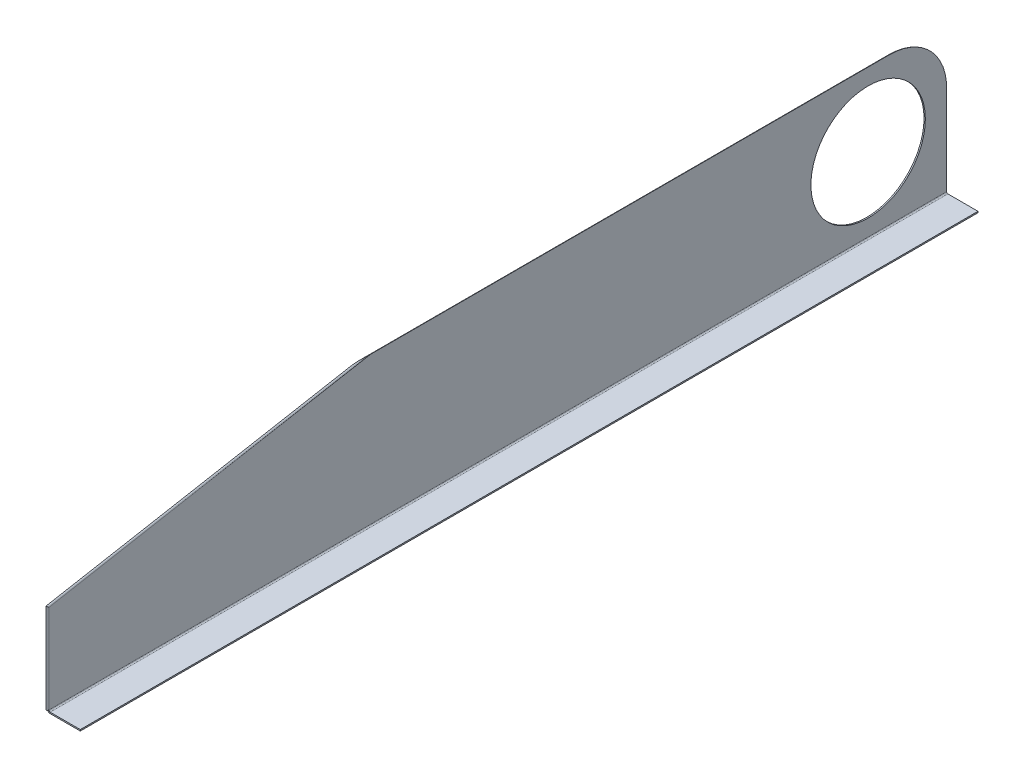
ISO-10303-21;
HEADER;
FILE_DESCRIPTION(('STEP AP214'),'2;1');
FILE_NAME('part.step','',(''),(''),'','','');
FILE_SCHEMA(('AUTOMOTIVE_DESIGN { 1 0 10303 214 1 1 1 1 }'));
ENDSEC;
DATA;
#1=APPLICATION_CONTEXT('core data for automotive mechanical design processes');
#2=APPLICATION_PROTOCOL_DEFINITION('international standard','automotive_design',2000,#1);
#3=PRODUCT_CONTEXT('',#1,'mechanical');
#4=PRODUCT('Part','Part','',(#3));
#5=PRODUCT_RELATED_PRODUCT_CATEGORY('part','',(#4));
#6=PRODUCT_DEFINITION_FORMATION('','',#4);
#7=PRODUCT_DEFINITION_CONTEXT('part definition',#1,'design');
#8=PRODUCT_DEFINITION('design','',#6,#7);
#9=PRODUCT_DEFINITION_SHAPE('','',#8);
#10=(LENGTH_UNIT() NAMED_UNIT(*) SI_UNIT(.MILLI.,.METRE.));
#11=(NAMED_UNIT(*) PLANE_ANGLE_UNIT() SI_UNIT($,.RADIAN.));
#12=(NAMED_UNIT(*) SI_UNIT($,.STERADIAN.) SOLID_ANGLE_UNIT());
#13=UNCERTAINTY_MEASURE_WITH_UNIT(LENGTH_MEASURE(1.E-05),#10,'distance_accuracy_value','');
#14=(GEOMETRIC_REPRESENTATION_CONTEXT(3) GLOBAL_UNCERTAINTY_ASSIGNED_CONTEXT((#13)) GLOBAL_UNIT_ASSIGNED_CONTEXT((#10,
#11,#12)) REPRESENTATION_CONTEXT('',''));
#15=CARTESIAN_POINT('',(0.,0.,0.));
#16=DIRECTION('',(0.,0.,1.));
#17=DIRECTION('',(1.,0.,0.));
#18=AXIS2_PLACEMENT_3D('',#15,#16,#17);
#19=CARTESIAN_POINT('',(-0.8,0.,0.));
#20=DIRECTION('',(1.,0.,0.));
#21=DIRECTION('',(0.,0.,-1.));
#22=AXIS2_PLACEMENT_3D('',#19,#20,#21);
#23=PLANE('',#22);
#24=CARTESIAN_POINT('',(-0.8,0.,-227.));
#25=DIRECTION('',(1.,0.,0.));
#26=DIRECTION('',(0.,0.,-1.));
#27=AXIS2_PLACEMENT_3D('',#24,#25,#26);
#28=CIRCLE('',#27,35.);
#29=CARTESIAN_POINT('',(-0.8,0.,-262.));
#30=VERTEX_POINT('',#29);
#31=EDGE_CURVE('E208',#30,#30,#28,.T.);
#32=ORIENTED_EDGE('',*,*,#31,.T.);
#33=EDGE_LOOP('',(#32));
#34=FACE_BOUND('',#33,.T.);
#35=CARTESIAN_POINT('',(-0.8,10.,-240.));
#36=DIRECTION('',(1.,0.,0.));
#37=DIRECTION('',(0.,0.,-1.));
#38=AXIS2_PLACEMENT_3D('',#35,#36,#37);
#39=CIRCLE('',#38,34.0202041028867);
#40=CARTESIAN_POINT('',(-0.8,44.0202041028868,-240.));
#41=VERTEX_POINT('',#40);
#42=CARTESIAN_POINT('',(-0.8,10.,-274.020204102887));
#43=VERTEX_POINT('',#42);
#44=EDGE_CURVE('E231',#41,#43,#39,.F.);
#45=ORIENTED_EDGE('',*,*,#44,.T.);
#46=DIRECTION('',(0.,-1.,0.));
#47=VECTOR('',#46,1.);
#48=CARTESIAN_POINT('',(-0.8,0.,-274.020204102887));
#49=LINE('',#48,#47);
#50=CARTESIAN_POINT('',(-0.8,-44.9999999999999,-274.020204102887));
#51=VERTEX_POINT('',#50);
#52=EDGE_CURVE('E233',#43,#51,#49,.T.);
#53=ORIENTED_EDGE('',*,*,#52,.T.);
#54=DIRECTION('',(0.,0.,-1.));
#55=VECTOR('',#54,1.);
#56=CARTESIAN_POINT('',(-0.8,-44.9999999999999,-275.));
#57=LINE('',#56,#55);
#58=CARTESIAN_POINT('',(-0.8,-45.,274.020204102887));
#59=VERTEX_POINT('',#58);
#60=EDGE_CURVE('E72',#59,#51,#57,.T.);
#61=ORIENTED_EDGE('',*,*,#60,.F.);
#62=CARTESIAN_POINT('',(-0.8,-45.,275.));
#63=VERTEX_POINT('',#62);
#64=EDGE_CURVE('E218',#63,#59,#57,.T.);
#65=ORIENTED_EDGE('',*,*,#64,.F.);
#66=DIRECTION('',(0.,-1.,0.));
#67=VECTOR('',#66,1.);
#68=CARTESIAN_POINT('',(-0.8,-45.,275.));
#69=LINE('',#68,#67);
#70=CARTESIAN_POINT('',(-0.8,10.1013836535921,275.));
#71=VERTEX_POINT('',#70);
#72=EDGE_CURVE('E214',#71,#63,#69,.T.);
#73=ORIENTED_EDGE('',*,*,#72,.F.);
#74=DIRECTION('',(0.,-0.178802215116343,0.983885037933543));
#75=VECTOR('',#74,1.);
#76=CARTESIAN_POINT('',(-0.8,10.1013836535921,275.));
#77=LINE('',#76,#75);
#78=CARTESIAN_POINT('',(-0.8,44.0202041028867,88.3567868681014));
#79=VERTEX_POINT('',#78);
#80=EDGE_CURVE('E212',#79,#71,#77,.T.);
#81=ORIENTED_EDGE('',*,*,#80,.F.);
#82=DIRECTION('',(0.,0.,-1.));
#83=VECTOR('',#82,1.);
#84=CARTESIAN_POINT('',(-0.8,44.0202041028867,0.));
#85=LINE('',#84,#83);
#86=EDGE_CURVE('E229',#79,#41,#85,.T.);
#87=ORIENTED_EDGE('',*,*,#86,.T.);
#88=EDGE_LOOP('',(#45,#53,#61,#65,#73,#81,#87));
#89=FACE_BOUND('',#88,.T.);
#90=ADVANCED_FACE('F57',(#34,#89),#23,.F.);
#91=CARTESIAN_POINT('',(0.,0.,0.));
#92=DIRECTION('',(1.,0.,0.));
#93=DIRECTION('',(0.,0.,-1.));
#94=AXIS2_PLACEMENT_3D('',#91,#92,#93);
#95=PLANE('',#94);
#96=CARTESIAN_POINT('',(0.,0.,-227.));
#97=DIRECTION('',(1.,0.,0.));
#98=DIRECTION('',(0.,0.,-1.));
#99=AXIS2_PLACEMENT_3D('',#96,#97,#98);
#100=CIRCLE('',#99,35.);
#101=CARTESIAN_POINT('',(0.,0.,-262.));
#102=VERTEX_POINT('',#101);
#103=EDGE_CURVE('E204',#102,#102,#100,.T.);
#104=ORIENTED_EDGE('',*,*,#103,.F.);
#105=EDGE_LOOP('',(#104));
#106=FACE_BOUND('',#105,.T.);
#107=DIRECTION('',(0.,-0.178802215116343,0.983885037933543));
#108=VECTOR('',#107,1.);
#109=CARTESIAN_POINT('',(0.,9.13737713019371,274.824810323234));
#110=LINE('',#109,#108);
#111=CARTESIAN_POINT('',(0.,45.,77.485543358915));
#112=VERTEX_POINT('',#111);
#113=CARTESIAN_POINT('',(0.,9.2835988623553,274.020204102887));
#114=VERTEX_POINT('',#113);
#115=EDGE_CURVE('E220',#112,#114,#110,.T.);
#116=ORIENTED_EDGE('',*,*,#115,.T.);
#117=DIRECTION('',(0.,-1.,0.));
#118=VECTOR('',#117,1.);
#119=CARTESIAN_POINT('',(0.,-45.,274.020204102887));
#120=LINE('',#119,#118);
#121=CARTESIAN_POINT('',(0.,-45.,274.020204102887));
#122=VERTEX_POINT('',#121);
#123=EDGE_CURVE('E244',#114,#122,#120,.T.);
#124=ORIENTED_EDGE('',*,*,#123,.T.);
#125=DIRECTION('',(0.,0.,-1.));
#126=VECTOR('',#125,1.);
#127=CARTESIAN_POINT('',(0.,-44.9999999999999,-275.));
#128=LINE('',#127,#126);
#129=CARTESIAN_POINT('',(0.,-44.9999999999999,-275.));
#130=VERTEX_POINT('',#129);
#131=EDGE_CURVE('E215',#122,#130,#128,.T.);
#132=ORIENTED_EDGE('',*,*,#131,.T.);
#133=DIRECTION('',(0.,1.,0.));
#134=VECTOR('',#133,1.);
#135=CARTESIAN_POINT('',(0.,-44.9999999999999,-275.));
#136=LINE('',#135,#134);
#137=CARTESIAN_POINT('',(0.,10.,-275.));
#138=VERTEX_POINT('',#137);
#139=EDGE_CURVE('E211',#130,#138,#136,.T.);
#140=ORIENTED_EDGE('',*,*,#139,.T.);
#141=CARTESIAN_POINT('',(0.,10.,-240.));
#142=DIRECTION('',(1.,0.,0.));
#143=DIRECTION('',(0.,0.,-1.));
#144=AXIS2_PLACEMENT_3D('',#141,#142,#143);
#145=CIRCLE('',#144,35.);
#146=CARTESIAN_POINT('',(0.,45.,-240.));
#147=VERTEX_POINT('',#146);
#148=EDGE_CURVE('E201',#147,#138,#145,.F.);
#149=ORIENTED_EDGE('',*,*,#148,.F.);
#150=DIRECTION('',(0.,0.,1.));
#151=VECTOR('',#150,1.);
#152=CARTESIAN_POINT('',(0.,45.0000000000001,-275.));
#153=LINE('',#152,#151);
#154=EDGE_CURVE('E223',#147,#112,#153,.T.);
#155=ORIENTED_EDGE('',*,*,#154,.T.);
#156=EDGE_LOOP('',(#116,#124,#132,#140,#149,#155));
#157=FACE_BOUND('',#156,.T.);
#158=ADVANCED_FACE('F268',(#106,#157),#95,.T.);
#159=CARTESIAN_POINT('',(-0.8,-44.9999999999999,-275.));
#160=DIRECTION('',(0.,-1.,0.));
#161=DIRECTION('',(0.,0.,-1.));
#162=AXIS2_PLACEMENT_3D('',#159,#160,#161);
#163=PLANE('',#162);
#164=DIRECTION('',(-1.,0.,0.));
#165=VECTOR('',#164,1.);
#166=CARTESIAN_POINT('',(0.,-44.9999999999999,274.020204102887));
#167=LINE('',#166,#165);
#168=EDGE_CURVE('E79',#122,#59,#167,.T.);
#169=ORIENTED_EDGE('',*,*,#168,.F.);
#170=CARTESIAN_POINT('',(-1.,-45.,274.020204102887));
#171=DIRECTION('',(0.,-1.,0.));
#172=DIRECTION('',(0.,0.,-1.));
#173=AXIS2_PLACEMENT_3D('',#170,#171,#172);
#174=CIRCLE('',#173,1.);
#175=EDGE_CURVE('E65',#122,#63,#174,.T.);
#176=ORIENTED_EDGE('',*,*,#175,.T.);
#177=ORIENTED_EDGE('',*,*,#64,.T.);
#178=EDGE_LOOP('',(#169,#176,#177));
#179=FACE_BOUND('',#178,.T.);
#180=ADVANCED_FACE('F274',(#179),#163,.T.);
#181=CARTESIAN_POINT('',(-10.,0.,-227.));
#182=DIRECTION('',(1.,0.,0.));
#183=DIRECTION('',(0.,0.,-1.));
#184=AXIS2_PLACEMENT_3D('',#181,#182,#183);
#185=CYLINDRICAL_SURFACE('',#184,35.);
#186=ORIENTED_EDGE('',*,*,#103,.T.);
#187=EDGE_LOOP('',(#186));
#188=FACE_BOUND('',#187,.T.);
#189=ORIENTED_EDGE('',*,*,#31,.F.);
#190=EDGE_LOOP('',(#189));
#191=FACE_BOUND('',#190,.T.);
#192=ADVANCED_FACE('F278',(#188,#191),#185,.F.);
#193=CARTESIAN_POINT('',(-1.,9.13737713019371,274.824810323234));
#194=DIRECTION('',(0.,0.178802215116343,-0.983885037933543));
#195=DIRECTION('',(0.,0.983885037933543,0.178802215116343));
#196=AXIS2_PLACEMENT_3D('',#193,#194,#195);
#197=CYLINDRICAL_SURFACE('',#196,1.);
#198=ORIENTED_EDGE('',*,*,#80,.T.);
#199=CARTESIAN_POINT('',(-1.,9.28359886235531,274.020204102887));
#200=DIRECTION('',(0.,0.767724630032261,-0.640779909517947));
#201=DIRECTION('',(0.,-0.640779909517947,-0.767724630032261));
#202=AXIS2_PLACEMENT_3D('',#199,#200,#201);
#203=ELLIPSE('',#202,1.30255036881906,1.);
#204=EDGE_CURVE('E13',#71,#114,#203,.T.);
#205=ORIENTED_EDGE('',*,*,#204,.T.);
#206=ORIENTED_EDGE('',*,*,#115,.F.);
#207=CARTESIAN_POINT('',(0.,45.,77.485543358915));
#208=CARTESIAN_POINT('',(-6.7275576903014E-06,44.9999878903568,77.6523706170615));
#209=CARTESIAN_POINT('',(-0.00133388447243087,44.9997276012035,77.8191964350259));
#210=CARTESIAN_POINT('',(-0.00654660789817051,44.9986472806778,78.15281875173));
#211=CARTESIAN_POINT('',(-0.0104323629015404,44.9978272080659,78.3196152474039));
#212=CARTESIAN_POINT('',(-0.0206761501885104,44.9955647284253,78.6530088375301));
#213=CARTESIAN_POINT('',(-0.0270324155144246,44.9941227661037,78.8196059893261));
#214=CARTESIAN_POINT('',(-0.0421456334807969,44.9904747201698,79.1526746162248));
#215=CARTESIAN_POINT('',(-0.0509024863690588,44.9882686683068,79.3191460962612));
#216=CARTESIAN_POINT('',(-0.0807654944301313,44.9802075004837,79.8201427045263));
#217=CARTESIAN_POINT('',(-0.105407053327853,44.972917908096,80.1544419518941));
#218=CARTESIAN_POINT('',(-0.162818320484073,44.9525565693464,80.8221786071442));
#219=CARTESIAN_POINT('',(-0.195588549838184,44.9394844522486,81.1556159583889));
#220=CARTESIAN_POINT('',(-0.266786402648193,44.9054484647027,81.8216168859797));
#221=CARTESIAN_POINT('',(-0.305216297244313,44.8844814208541,82.1541800567448));
#222=CARTESIAN_POINT('',(-0.384026324026635,44.8332909411318,82.8183512968289));
#223=CARTESIAN_POINT('',(-0.424406407861402,44.803067734649,83.1499593896115));
#224=CARTESIAN_POINT('',(-0.502905227644693,44.7334166148011,83.812280942873));
#225=CARTESIAN_POINT('',(-0.541025256945162,44.6939940309493,84.1429948096144));
#226=CARTESIAN_POINT('',(-0.611409520090956,44.6073448879516,84.8040375881802));
#227=CARTESIAN_POINT('',(-0.643673571274627,44.5601180854616,85.1343664876775));
#228=CARTESIAN_POINT('',(-0.699942758648823,44.4599850162026,85.7947332924578));
#229=CARTESIAN_POINT('',(-0.723951117828667,44.4070809764119,86.1247712610134));
#230=CARTESIAN_POINT('',(-0.762526033095699,44.2975590843802,86.7847671344524));
#231=CARTESIAN_POINT('',(-0.777093334510314,44.2409415256928,87.1147250435998));
#232=CARTESIAN_POINT('',(-0.788842334121543,44.1697807702975,87.520620244808));
#233=CARTESIAN_POINT('',(-0.790776304529497,44.1563881977807,87.5966377734463));
#234=CARTESIAN_POINT('',(-0.794104049542676,44.1294787214625,87.748662662239));
#235=CARTESIAN_POINT('',(-0.795497827463901,44.1159618184248,87.824670022453));
#236=CARTESIAN_POINT('',(-0.797737291886915,44.0888050168626,87.9767055970001));
#237=CARTESIAN_POINT('',(-0.798582734680272,44.0751650663765,88.0527338056019));
#238=CARTESIAN_POINT('',(-0.79971385928186,44.0477702413656,88.2047736651975));
#239=CARTESIAN_POINT('',(-0.799999541105114,44.034015366844,88.2807853161918));
#240=CARTESIAN_POINT('',(-0.8,44.0202041028867,88.3567868681014));
#241=B_SPLINE_CURVE_WITH_KNOTS('',3,(#207,#208,#209,#210,#211,#212,#213,#214,#215,#216,#217,
#218,#219,#220,#221,#222,#223,#224,#225,#226,#227,#228,#229,#230,#231,#232,#233,#234,#235,#236,
#237,#238,#239,#240),.UNSPECIFIED.,.F.,.F.,(4,2,2,2,2,2,2,2,2,2,2,2,2,2,2,2,4),(0.,
0.500474259425271,1.00098539300294,1.50113920793572,2.00127224300536,3.0069629832493,
4.01271821085745,5.01887813850509,6.02501313302078,7.03056667999987,8.03615158715786,
9.04134347108242,10.0464559901319,10.278092569424,10.509727726781,10.7414657643361,
10.9732037956715),.UNSPECIFIED.);
#242=EDGE_CURVE('E238',#112,#79,#241,.T.);
#243=ORIENTED_EDGE('',*,*,#242,.T.);
#244=EDGE_LOOP('',(#198,#205,#206,#243));
#245=FACE_BOUND('',#244,.T.);
#246=ADVANCED_FACE('F246',(#245),#197,.T.);
#247=CARTESIAN_POINT('',(0.2,44.0202041028868,-275.));
#248=DIRECTION('',(0.,0.,-1.));
#249=DIRECTION('',(0.,1.,0.));
#250=AXIS2_PLACEMENT_3D('',#247,#248,#249);
#251=CYLINDRICAL_SURFACE('',#250,1.);
#252=ORIENTED_EDGE('',*,*,#242,.F.);
#253=ORIENTED_EDGE('',*,*,#154,.F.);
#254=CARTESIAN_POINT('',(0.2,44.0202041028868,-240.));
#255=DIRECTION('',(0.,0.,-1.));
#256=DIRECTION('',(-1.,0.,0.));
#257=AXIS2_PLACEMENT_3D('',#254,#255,#256);
#258=CIRCLE('',#257,1.);
#259=EDGE_CURVE('E205',#41,#147,#258,.T.);
#260=ORIENTED_EDGE('',*,*,#259,.F.);
#261=ORIENTED_EDGE('',*,*,#86,.F.);
#262=EDGE_LOOP('',(#252,#253,#260,#261));
#263=FACE_BOUND('',#262,.T.);
#264=ADVANCED_FACE('F250',(#263),#251,.T.);
#265=CARTESIAN_POINT('',(0.2,10.,-240.));
#266=DIRECTION('',(-1.,0.,0.));
#267=DIRECTION('',(0.,0.,1.));
#268=AXIS2_PLACEMENT_3D('',#265,#266,#267);
#269=TOROIDAL_SURFACE('',#268,34.0202041028867,1.);
#270=ORIENTED_EDGE('',*,*,#259,.T.);
#271=ORIENTED_EDGE('',*,*,#148,.T.);
#272=CARTESIAN_POINT('',(0.2,10.,-274.020204102887));
#273=DIRECTION('',(0.,-1.,0.));
#274=DIRECTION('',(0.,0.,-1.));
#275=AXIS2_PLACEMENT_3D('',#272,#273,#274);
#276=CIRCLE('',#275,1.);
#277=EDGE_CURVE('E199',#43,#138,#276,.T.);
#278=ORIENTED_EDGE('',*,*,#277,.F.);
#279=ORIENTED_EDGE('',*,*,#44,.F.);
#280=EDGE_LOOP('',(#270,#271,#278,#279));
#281=FACE_BOUND('',#280,.T.);
#282=ADVANCED_FACE('F254',(#281),#269,.T.);
#283=CARTESIAN_POINT('',(0.2,-44.9999999999999,-274.020204102887));
#284=DIRECTION('',(0.,-1.,0.));
#285=DIRECTION('',(0.,0.,-1.));
#286=AXIS2_PLACEMENT_3D('',#283,#284,#285);
#287=CYLINDRICAL_SURFACE('',#286,1.);
#288=CARTESIAN_POINT('',(0.2,-44.9999999999999,-274.020204102887));
#289=DIRECTION('',(0.,-1.,0.));
#290=DIRECTION('',(0.,0.,-1.));
#291=AXIS2_PLACEMENT_3D('',#288,#289,#290);
#292=CIRCLE('',#291,1.);
#293=EDGE_CURVE('E235',#51,#130,#292,.T.);
#294=ORIENTED_EDGE('',*,*,#293,.F.);
#295=ORIENTED_EDGE('',*,*,#52,.F.);
#296=ORIENTED_EDGE('',*,*,#277,.T.);
#297=ORIENTED_EDGE('',*,*,#139,.F.);
#298=EDGE_LOOP('',(#294,#295,#296,#297));
#299=FACE_BOUND('',#298,.T.);
#300=ADVANCED_FACE('F257',(#299),#287,.T.);
#301=CARTESIAN_POINT('',(-1.,-45.,274.020204102887));
#302=DIRECTION('',(0.,1.,0.));
#303=DIRECTION('',(0.,0.,1.));
#304=AXIS2_PLACEMENT_3D('',#301,#302,#303);
#305=CYLINDRICAL_SURFACE('',#304,1.);
#306=ORIENTED_EDGE('',*,*,#204,.F.);
#307=ORIENTED_EDGE('',*,*,#72,.T.);
#308=ORIENTED_EDGE('',*,*,#175,.F.);
#309=ORIENTED_EDGE('',*,*,#123,.F.);
#310=EDGE_LOOP('',(#306,#307,#308,#309));
#311=FACE_BOUND('',#310,.T.);
#312=ADVANCED_FACE('F59',(#311),#305,.T.);
#313=CARTESIAN_POINT('',(0.800000000000004,-45.,274.020204102887));
#314=DIRECTION('',(0.,0.,1.));
#315=DIRECTION('',(1.,0.,0.));
#316=AXIS2_PLACEMENT_3D('',#313,#314,#315);
#317=PLANE('',#316);
#318=DIRECTION('',(0.,1.,0.));
#319=VECTOR('',#318,1.);
#320=CARTESIAN_POINT('',(0.799999999999992,-46.6,274.020204102887));
#321=LINE('',#320,#319);
#322=CARTESIAN_POINT('',(0.800000000000001,-45.8,274.020204102887));
#323=VERTEX_POINT('',#322);
#324=CARTESIAN_POINT('',(0.799999999999998,-46.6,274.020204102887));
#325=VERTEX_POINT('',#324);
#326=EDGE_CURVE('E164',#323,#325,#321,.F.);
#327=ORIENTED_EDGE('',*,*,#326,.F.);
#328=CARTESIAN_POINT('',(0.800000000000004,-45.,274.020204102887));
#329=DIRECTION('',(0.,0.,-1.));
#330=DIRECTION('',(-1.,0.,0.));
#331=AXIS2_PLACEMENT_3D('',#328,#329,#330);
#332=CIRCLE('',#331,0.800000000000023);
#333=EDGE_CURVE('E192',#122,#323,#332,.F.);
#334=ORIENTED_EDGE('',*,*,#333,.F.);
#335=ORIENTED_EDGE('',*,*,#168,.T.);
#336=CARTESIAN_POINT('',(0.800000000000004,-45.,274.020204102887));
#337=DIRECTION('',(0.,0.,-1.));
#338=DIRECTION('',(-1.,0.,0.));
#339=AXIS2_PLACEMENT_3D('',#336,#337,#338);
#340=CIRCLE('',#339,1.60000000000002);
#341=EDGE_CURVE('E185',#59,#325,#340,.F.);
#342=ORIENTED_EDGE('',*,*,#341,.T.);
#343=EDGE_LOOP('',(#327,#334,#335,#342));
#344=FACE_BOUND('',#343,.T.);
#345=ADVANCED_FACE('F264',(#344),#317,.T.);
#346=CARTESIAN_POINT('',(0.,-44.9999999999999,-0.489897948556584));
#347=DIRECTION('',(0.,1.,0.));
#348=DIRECTION('',(0.,0.,-1.));
#349=AXIS2_PLACEMENT_3D('',#346,#347,#348);
#350=PLANE('',#349);
#351=DIRECTION('',(0.,0.,-1.));
#352=VECTOR('',#351,1.);
#353=CARTESIAN_POINT('',(-0.799999999999982,-44.9999999999999,-275.));
#354=LINE('',#353,#352);
#355=CARTESIAN_POINT('',(-0.799999999999982,-44.9999999999999,-275.));
#356=VERTEX_POINT('',#355);
#357=EDGE_CURVE('E182',#356,#51,#354,.F.);
#358=ORIENTED_EDGE('',*,*,#357,.T.);
#359=ORIENTED_EDGE('',*,*,#293,.T.);
#360=DIRECTION('',(-1.,0.,0.));
#361=VECTOR('',#360,1.);
#362=CARTESIAN_POINT('',(0.,-44.9999999999999,-275.));
#363=LINE('',#362,#361);
#364=EDGE_CURVE('E189',#130,#356,#363,.T.);
#365=ORIENTED_EDGE('',*,*,#364,.T.);
#366=EDGE_LOOP('',(#358,#359,#365));
#367=FACE_BOUND('',#366,.T.);
#368=ADVANCED_FACE('F310',(#367),#350,.T.);
#369=CARTESIAN_POINT('',(0.800000000000041,-45.,-275.));
#370=DIRECTION('',(0.,0.,1.));
#371=DIRECTION('',(1.,0.,0.));
#372=AXIS2_PLACEMENT_3D('',#369,#370,#371);
#373=PLANE('',#372);
#374=CARTESIAN_POINT('',(0.800000000000041,-45.,-275.));
#375=DIRECTION('',(0.,0.,-1.));
#376=DIRECTION('',(-1.,0.,0.));
#377=AXIS2_PLACEMENT_3D('',#374,#375,#376);
#378=CIRCLE('',#377,0.800000000000023);
#379=CARTESIAN_POINT('',(0.800000000000038,-45.8,-275.));
#380=VERTEX_POINT('',#379);
#381=EDGE_CURVE('E195',#380,#130,#378,.T.);
#382=ORIENTED_EDGE('',*,*,#381,.F.);
#383=DIRECTION('',(0.,1.,0.));
#384=VECTOR('',#383,1.);
#385=CARTESIAN_POINT('',(0.800000000000044,-45.7999999999999,-275.));
#386=LINE('',#385,#384);
#387=CARTESIAN_POINT('',(0.800000000000041,-46.5999999999999,-275.));
#388=VERTEX_POINT('',#387);
#389=EDGE_CURVE('E176',#380,#388,#386,.F.);
#390=ORIENTED_EDGE('',*,*,#389,.T.);
#391=CARTESIAN_POINT('',(0.800000000000041,-45.,-275.));
#392=DIRECTION('',(0.,0.,-1.));
#393=DIRECTION('',(-1.,0.,0.));
#394=AXIS2_PLACEMENT_3D('',#391,#392,#393);
#395=CIRCLE('',#394,1.60000000000002);
#396=EDGE_CURVE('E186',#388,#356,#395,.T.);
#397=ORIENTED_EDGE('',*,*,#396,.T.);
#398=ORIENTED_EDGE('',*,*,#364,.F.);
#399=EDGE_LOOP('',(#382,#390,#397,#398));
#400=FACE_BOUND('',#399,.T.);
#401=ADVANCED_FACE('F314',(#400),#373,.F.);
#402=CARTESIAN_POINT('',(0.800000000000041,-45.,-275.));
#403=DIRECTION('',(0.,0.,-1.));
#404=DIRECTION('',(0.,-1.,0.));
#405=AXIS2_PLACEMENT_3D('',#402,#403,#404);
#406=CYLINDRICAL_SURFACE('',#405,1.60000000000002);
#407=ORIENTED_EDGE('',*,*,#357,.F.);
#408=ORIENTED_EDGE('',*,*,#396,.F.);
#409=DIRECTION('',(0.,0.,-1.));
#410=VECTOR('',#409,1.);
#411=CARTESIAN_POINT('',(0.799999999999992,-46.6,274.020204102887));
#412=LINE('',#411,#410);
#413=EDGE_CURVE('E174',#388,#325,#412,.F.);
#414=ORIENTED_EDGE('',*,*,#413,.T.);
#415=ORIENTED_EDGE('',*,*,#341,.F.);
#416=ORIENTED_EDGE('',*,*,#60,.T.);
#417=EDGE_LOOP('',(#407,#408,#414,#415,#416));
#418=FACE_BOUND('',#417,.T.);
#419=ADVANCED_FACE('F325',(#418),#406,.T.);
#420=CARTESIAN_POINT('',(0.800000000000041,-45.,-275.));
#421=DIRECTION('',(0.,0.,-1.));
#422=DIRECTION('',(0.,-1.,0.));
#423=AXIS2_PLACEMENT_3D('',#420,#421,#422);
#424=CYLINDRICAL_SURFACE('',#423,0.800000000000023);
#425=ORIENTED_EDGE('',*,*,#131,.F.);
#426=ORIENTED_EDGE('',*,*,#333,.T.);
#427=DIRECTION('',(0.,0.,-1.));
#428=VECTOR('',#427,1.);
#429=CARTESIAN_POINT('',(0.799999999999995,-45.8,274.020204102887));
#430=LINE('',#429,#428);
#431=EDGE_CURVE('E179',#323,#380,#430,.T.);
#432=ORIENTED_EDGE('',*,*,#431,.T.);
#433=ORIENTED_EDGE('',*,*,#381,.T.);
#434=EDGE_LOOP('',(#425,#426,#432,#433));
#435=FACE_BOUND('',#434,.T.);
#436=ADVANCED_FACE('F316',(#435),#424,.F.);
#437=CARTESIAN_POINT('',(19.2,-46.6,-275.));
#438=DIRECTION('',(0.,0.,1.));
#439=DIRECTION('',(0.,-1.,0.));
#440=AXIS2_PLACEMENT_3D('',#437,#438,#439);
#441=PLANE('',#440);
#442=ORIENTED_EDGE('',*,*,#389,.F.);
#443=DIRECTION('',(-1.,0.,0.));
#444=VECTOR('',#443,1.);
#445=CARTESIAN_POINT('',(19.2,-45.8,-275.));
#446=LINE('',#445,#444);
#447=CARTESIAN_POINT('',(19.2,-45.8,-275.));
#448=VERTEX_POINT('',#447);
#449=EDGE_CURVE('E172',#380,#448,#446,.F.);
#450=ORIENTED_EDGE('',*,*,#449,.T.);
#451=DIRECTION('',(0.,1.,0.));
#452=VECTOR('',#451,1.);
#453=CARTESIAN_POINT('',(19.2,-46.6,-275.));
#454=LINE('',#453,#452);
#455=CARTESIAN_POINT('',(19.2,-46.6,-275.));
#456=VERTEX_POINT('',#455);
#457=EDGE_CURVE('E160',#456,#448,#454,.T.);
#458=ORIENTED_EDGE('',*,*,#457,.F.);
#459=DIRECTION('',(1.,0.,0.));
#460=VECTOR('',#459,1.);
#461=CARTESIAN_POINT('',(-1.654235109439E-13,-46.5999999999999,-275.));
#462=LINE('',#461,#460);
#463=EDGE_CURVE('E147',#388,#456,#462,.T.);
#464=ORIENTED_EDGE('',*,*,#463,.F.);
#465=EDGE_LOOP('',(#442,#450,#458,#464));
#466=FACE_BOUND('',#465,.T.);
#467=ADVANCED_FACE('F322',(#466),#441,.F.);
#468=CARTESIAN_POINT('',(0.,-46.6,274.020204102887));
#469=DIRECTION('',(0.,0.,-1.));
#470=DIRECTION('',(0.,1.,0.));
#471=AXIS2_PLACEMENT_3D('',#468,#469,#470);
#472=PLANE('',#471);
#473=ORIENTED_EDGE('',*,*,#326,.T.);
#474=DIRECTION('',(-1.,0.,0.));
#475=VECTOR('',#474,1.);
#476=CARTESIAN_POINT('',(-1.654235109439E-13,-46.6,274.020204102887));
#477=LINE('',#476,#475);
#478=CARTESIAN_POINT('',(19.2,-46.6000000000001,274.020204102887));
#479=VERTEX_POINT('',#478);
#480=EDGE_CURVE('E145',#479,#325,#477,.T.);
#481=ORIENTED_EDGE('',*,*,#480,.F.);
#482=DIRECTION('',(0.,1.,0.));
#483=VECTOR('',#482,1.);
#484=CARTESIAN_POINT('',(19.2,-46.6000000000001,274.020204102887));
#485=LINE('',#484,#483);
#486=CARTESIAN_POINT('',(19.2,-45.8000000000001,274.020204102887));
#487=VERTEX_POINT('',#486);
#488=EDGE_CURVE('E153',#479,#487,#485,.T.);
#489=ORIENTED_EDGE('',*,*,#488,.T.);
#490=DIRECTION('',(1.,0.,0.));
#491=VECTOR('',#490,1.);
#492=CARTESIAN_POINT('',(0.,-45.8,274.020204102887));
#493=LINE('',#492,#491);
#494=EDGE_CURVE('E169',#487,#323,#493,.F.);
#495=ORIENTED_EDGE('',*,*,#494,.T.);
#496=EDGE_LOOP('',(#473,#481,#489,#495));
#497=FACE_BOUND('',#496,.T.);
#498=ADVANCED_FACE('F163',(#497),#472,.F.);
#499=CARTESIAN_POINT('',(-1.654235109439E-13,-46.6,0.));
#500=DIRECTION('',(0.,1.,0.));
#501=DIRECTION('',(-1.,0.,0.));
#502=AXIS2_PLACEMENT_3D('',#499,#500,#501);
#503=PLANE('',#502);
#504=ORIENTED_EDGE('',*,*,#413,.F.);
#505=ORIENTED_EDGE('',*,*,#463,.T.);
#506=DIRECTION('',(0.,0.,1.));
#507=VECTOR('',#506,1.);
#508=CARTESIAN_POINT('',(19.2,-46.6,0.));
#509=LINE('',#508,#507);
#510=EDGE_CURVE('E140',#456,#479,#509,.T.);
#511=ORIENTED_EDGE('',*,*,#510,.T.);
#512=ORIENTED_EDGE('',*,*,#480,.T.);
#513=EDGE_LOOP('',(#504,#505,#511,#512));
#514=FACE_BOUND('',#513,.T.);
#515=ADVANCED_FACE('F143',(#514),#503,.F.);
#516=CARTESIAN_POINT('',(-1.62630325872826E-13,-45.8,0.));
#517=DIRECTION('',(0.,1.,0.));
#518=DIRECTION('',(-1.,0.,0.));
#519=AXIS2_PLACEMENT_3D('',#516,#517,#518);
#520=PLANE('',#519);
#521=ORIENTED_EDGE('',*,*,#449,.F.);
#522=ORIENTED_EDGE('',*,*,#431,.F.);
#523=ORIENTED_EDGE('',*,*,#494,.F.);
#524=DIRECTION('',(0.,0.,-1.));
#525=VECTOR('',#524,1.);
#526=CARTESIAN_POINT('',(19.2,-45.8000000000001,274.020204102887));
#527=LINE('',#526,#525);
#528=EDGE_CURVE('E156',#448,#487,#527,.F.);
#529=ORIENTED_EDGE('',*,*,#528,.F.);
#530=EDGE_LOOP('',(#521,#522,#523,#529));
#531=FACE_BOUND('',#530,.T.);
#532=ADVANCED_FACE('F320',(#531),#520,.T.);
#533=CARTESIAN_POINT('',(19.2,-46.6000000000001,274.020204102887));
#534=DIRECTION('',(-1.,0.,0.));
#535=DIRECTION('',(0.,-1.,0.));
#536=AXIS2_PLACEMENT_3D('',#533,#534,#535);
#537=PLANE('',#536);
#538=ORIENTED_EDGE('',*,*,#528,.T.);
#539=ORIENTED_EDGE('',*,*,#488,.F.);
#540=ORIENTED_EDGE('',*,*,#510,.F.);
#541=ORIENTED_EDGE('',*,*,#457,.T.);
#542=EDGE_LOOP('',(#538,#539,#540,#541));
#543=FACE_BOUND('',#542,.T.);
#544=ADVANCED_FACE('F154',(#543),#537,.F.);
#545=CLOSED_SHELL('',(#90,#158,#180,#192,#246,#264,#282,#300,#312,#345,#368,#401,#419,#436,#467,
#498,#515,#532,#544));
#546=MANIFOLD_SOLID_BREP('B2',#545);
#547=ADVANCED_BREP_SHAPE_REPRESENTATION('',(#18,#546),#14);
#548=SHAPE_DEFINITION_REPRESENTATION(#9,#547);
ENDSEC;
END-ISO-10303-21;
